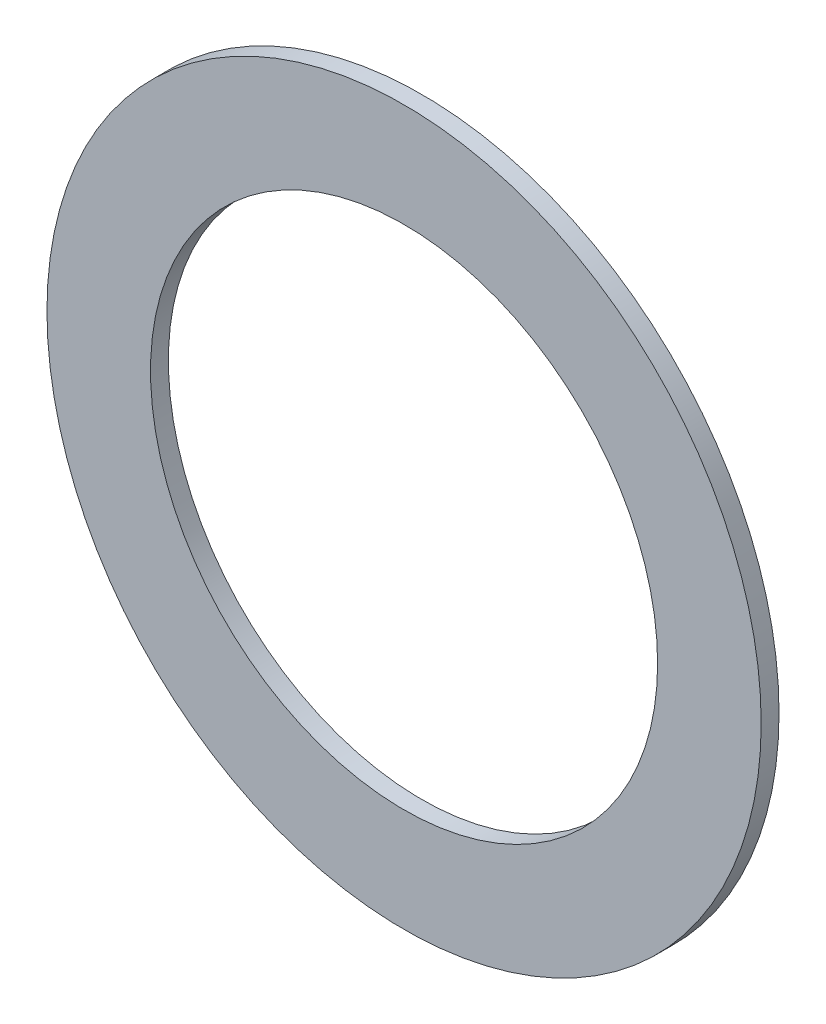
ISO-10303-21;
HEADER;
FILE_DESCRIPTION(('STEP AP214'),'2;1');
FILE_NAME('part.step','',(''),(''),'','','');
FILE_SCHEMA(('AUTOMOTIVE_DESIGN { 1 0 10303 214 1 1 1 1 }'));
ENDSEC;
DATA;
#1=APPLICATION_CONTEXT('core data for automotive mechanical design processes');
#2=APPLICATION_PROTOCOL_DEFINITION('international standard','automotive_design',2000,#1);
#3=PRODUCT_CONTEXT('',#1,'mechanical');
#4=PRODUCT('Part','Part','',(#3));
#5=PRODUCT_RELATED_PRODUCT_CATEGORY('part','',(#4));
#6=PRODUCT_DEFINITION_FORMATION('','',#4);
#7=PRODUCT_DEFINITION_CONTEXT('part definition',#1,'design');
#8=PRODUCT_DEFINITION('design','',#6,#7);
#9=PRODUCT_DEFINITION_SHAPE('','',#8);
#10=(LENGTH_UNIT() NAMED_UNIT(*) SI_UNIT(.MILLI.,.METRE.));
#11=(NAMED_UNIT(*) PLANE_ANGLE_UNIT() SI_UNIT($,.RADIAN.));
#12=(NAMED_UNIT(*) SI_UNIT($,.STERADIAN.) SOLID_ANGLE_UNIT());
#13=UNCERTAINTY_MEASURE_WITH_UNIT(LENGTH_MEASURE(1.E-05),#10,'distance_accuracy_value','');
#14=(GEOMETRIC_REPRESENTATION_CONTEXT(3) GLOBAL_UNCERTAINTY_ASSIGNED_CONTEXT((#13)) GLOBAL_UNIT_ASSIGNED_CONTEXT((#10,
#11,#12)) REPRESENTATION_CONTEXT('',''));
#15=CARTESIAN_POINT('',(0.,0.,0.));
#16=DIRECTION('',(0.,0.,1.));
#17=DIRECTION('',(1.,0.,0.));
#18=AXIS2_PLACEMENT_3D('',#15,#16,#17);
#19=CARTESIAN_POINT('',(0.,0.,0.5));
#20=DIRECTION('',(0.,0.,1.));
#21=DIRECTION('',(1.,0.,0.));
#22=AXIS2_PLACEMENT_3D('',#19,#20,#21);
#23=PLANE('',#22);
#24=CARTESIAN_POINT('',(0.,0.,0.5));
#25=DIRECTION('',(0.,0.,1.));
#26=DIRECTION('',(1.,0.,0.));
#27=AXIS2_PLACEMENT_3D('',#24,#25,#26);
#28=CIRCLE('',#27,10.);
#29=CARTESIAN_POINT('',(10.,0.,0.5));
#30=VERTEX_POINT('',#29);
#31=EDGE_CURVE('E10',#30,#30,#28,.T.);
#32=ORIENTED_EDGE('',*,*,#31,.T.);
#33=EDGE_LOOP('',(#32));
#34=FACE_BOUND('',#33,.T.);
#35=CARTESIAN_POINT('',(0.,0.,0.5));
#36=DIRECTION('',(0.,0.,1.));
#37=DIRECTION('',(1.,0.,0.));
#38=AXIS2_PLACEMENT_3D('',#35,#36,#37);
#39=CIRCLE('',#38,7.1);
#40=CARTESIAN_POINT('',(7.1,0.,0.5));
#41=VERTEX_POINT('',#40);
#42=EDGE_CURVE('E359',#41,#41,#39,.T.);
#43=ORIENTED_EDGE('',*,*,#42,.F.);
#44=EDGE_LOOP('',(#43));
#45=FACE_BOUND('',#44,.T.);
#46=ADVANCED_FACE('F348',(#34,#45),#23,.T.);
#47=CARTESIAN_POINT('',(0.,0.,0.));
#48=DIRECTION('',(0.,0.,1.));
#49=DIRECTION('',(1.,0.,0.));
#50=AXIS2_PLACEMENT_3D('',#47,#48,#49);
#51=PLANE('',#50);
#52=CARTESIAN_POINT('',(0.,0.,0.));
#53=DIRECTION('',(0.,0.,1.));
#54=DIRECTION('',(1.,0.,0.));
#55=AXIS2_PLACEMENT_3D('',#52,#53,#54);
#56=CIRCLE('',#55,10.);
#57=CARTESIAN_POINT('',(10.,0.,0.));
#58=VERTEX_POINT('',#57);
#59=EDGE_CURVE('E355',#58,#58,#56,.T.);
#60=ORIENTED_EDGE('',*,*,#59,.F.);
#61=EDGE_LOOP('',(#60));
#62=FACE_BOUND('',#61,.T.);
#63=CARTESIAN_POINT('',(0.,0.,0.));
#64=DIRECTION('',(0.,0.,1.));
#65=DIRECTION('',(1.,0.,0.));
#66=AXIS2_PLACEMENT_3D('',#63,#64,#65);
#67=CIRCLE('',#66,7.1);
#68=CARTESIAN_POINT('',(7.1,0.,0.));
#69=VERTEX_POINT('',#68);
#70=EDGE_CURVE('E363',#69,#69,#67,.T.);
#71=ORIENTED_EDGE('',*,*,#70,.T.);
#72=EDGE_LOOP('',(#71));
#73=FACE_BOUND('',#72,.T.);
#74=ADVANCED_FACE('F369',(#62,#73),#51,.F.);
#75=CARTESIAN_POINT('',(0.,0.,0.5));
#76=DIRECTION('',(0.,0.,-1.));
#77=DIRECTION('',(-1.,0.,0.));
#78=AXIS2_PLACEMENT_3D('',#75,#76,#77);
#79=CYLINDRICAL_SURFACE('',#78,10.);
#80=ORIENTED_EDGE('',*,*,#31,.F.);
#81=EDGE_LOOP('',(#80));
#82=FACE_BOUND('',#81,.T.);
#83=ORIENTED_EDGE('',*,*,#59,.T.);
#84=EDGE_LOOP('',(#83));
#85=FACE_BOUND('',#84,.T.);
#86=ADVANCED_FACE('F350',(#82,#85),#79,.T.);
#87=CARTESIAN_POINT('',(0.,0.,0.5));
#88=DIRECTION('',(0.,0.,-1.));
#89=DIRECTION('',(-1.,0.,0.));
#90=AXIS2_PLACEMENT_3D('',#87,#88,#89);
#91=CYLINDRICAL_SURFACE('',#90,7.1);
#92=ORIENTED_EDGE('',*,*,#42,.T.);
#93=EDGE_LOOP('',(#92));
#94=FACE_BOUND('',#93,.T.);
#95=ORIENTED_EDGE('',*,*,#70,.F.);
#96=EDGE_LOOP('',(#95));
#97=FACE_BOUND('',#96,.T.);
#98=ADVANCED_FACE('F371',(#94,#97),#91,.F.);
#99=CLOSED_SHELL('',(#46,#74,#86,#98));
#100=MANIFOLD_SOLID_BREP('B2',#99);
#101=ADVANCED_BREP_SHAPE_REPRESENTATION('',(#18,#100),#14);
#102=SHAPE_DEFINITION_REPRESENTATION(#9,#101);
ENDSEC;
END-ISO-10303-21;
